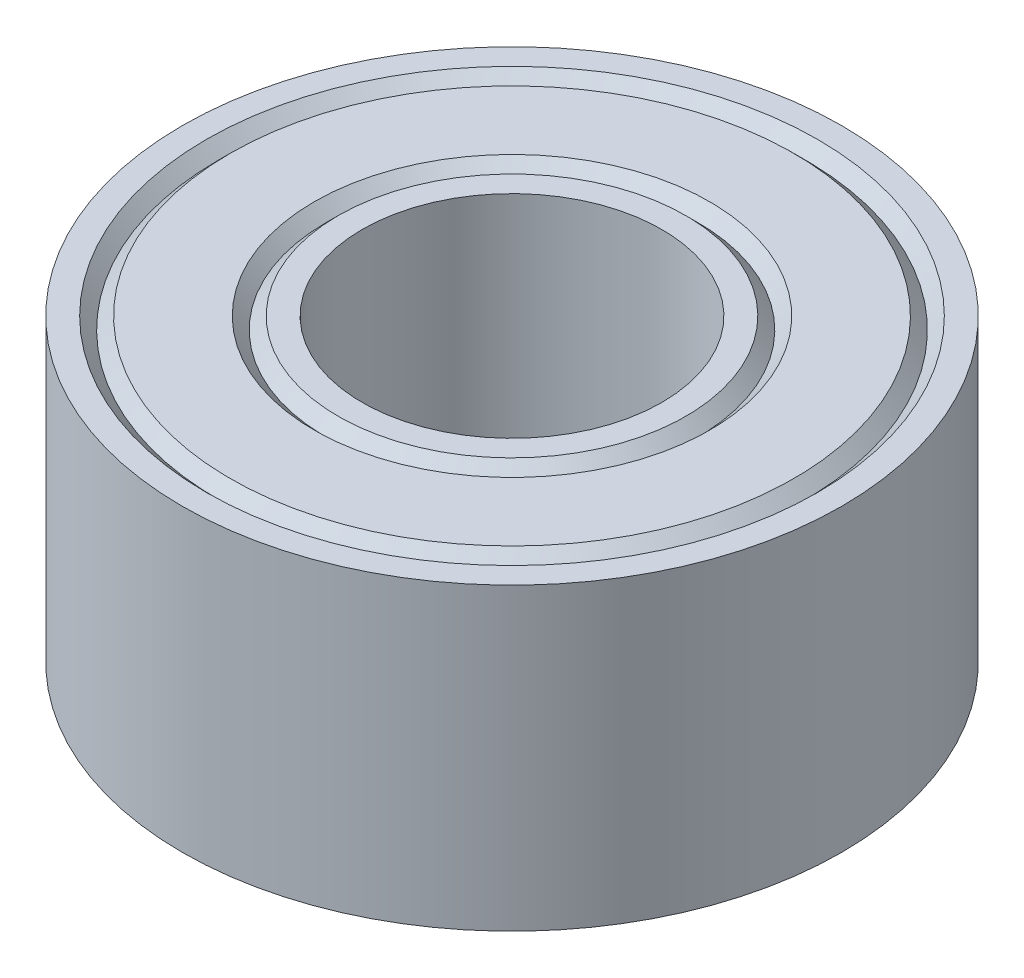
ISO-10303-21;
HEADER;
FILE_DESCRIPTION(('STEP AP214'),'2;1');
FILE_NAME('part.step','',(''),(''),'','','');
FILE_SCHEMA(('AUTOMOTIVE_DESIGN { 1 0 10303 214 1 1 1 1 }'));
ENDSEC;
DATA;
#1=APPLICATION_CONTEXT('core data for automotive mechanical design processes');
#2=APPLICATION_PROTOCOL_DEFINITION('international standard','automotive_design',2000,#1);
#3=PRODUCT_CONTEXT('',#1,'mechanical');
#4=PRODUCT('Part','Part','',(#3));
#5=PRODUCT_RELATED_PRODUCT_CATEGORY('part','',(#4));
#6=PRODUCT_DEFINITION_FORMATION('','',#4);
#7=PRODUCT_DEFINITION_CONTEXT('part definition',#1,'design');
#8=PRODUCT_DEFINITION('design','',#6,#7);
#9=PRODUCT_DEFINITION_SHAPE('','',#8);
#10=(LENGTH_UNIT() NAMED_UNIT(*) SI_UNIT(.MILLI.,.METRE.));
#11=(NAMED_UNIT(*) PLANE_ANGLE_UNIT() SI_UNIT($,.RADIAN.));
#12=(NAMED_UNIT(*) SI_UNIT($,.STERADIAN.) SOLID_ANGLE_UNIT());
#13=UNCERTAINTY_MEASURE_WITH_UNIT(LENGTH_MEASURE(1.E-05),#10,'distance_accuracy_value','');
#14=(GEOMETRIC_REPRESENTATION_CONTEXT(3) GLOBAL_UNCERTAINTY_ASSIGNED_CONTEXT((#13)) GLOBAL_UNIT_ASSIGNED_CONTEXT((#10,
#11,#12)) REPRESENTATION_CONTEXT('',''));
#15=CARTESIAN_POINT('',(0.,0.,0.));
#16=DIRECTION('',(0.,0.,1.));
#17=DIRECTION('',(1.,0.,0.));
#18=AXIS2_PLACEMENT_3D('',#15,#16,#17);
#19=CARTESIAN_POINT('',(0.,2.5,0.));
#20=DIRECTION('',(0.,1.,0.));
#21=DIRECTION('',(-1.,0.,0.));
#22=AXIS2_PLACEMENT_3D('',#19,#20,#21);
#23=CYLINDRICAL_SURFACE('',#22,2.5);
#24=CARTESIAN_POINT('',(0.,2.5,0.));
#25=DIRECTION('',(0.,1.,0.));
#26=DIRECTION('',(-1.,0.,0.));
#27=AXIS2_PLACEMENT_3D('',#24,#25,#26);
#28=CIRCLE('',#27,2.5);
#29=CARTESIAN_POINT('',(-2.5,2.5,0.));
#30=VERTEX_POINT('',#29);
#31=EDGE_CURVE('E83',#30,#30,#28,.T.);
#32=ORIENTED_EDGE('',*,*,#31,.T.);
#33=EDGE_LOOP('',(#32));
#34=FACE_BOUND('',#33,.T.);
#35=CARTESIAN_POINT('',(0.,-2.5,0.));
#36=DIRECTION('',(0.,1.,0.));
#37=DIRECTION('',(-1.,0.,0.));
#38=AXIS2_PLACEMENT_3D('',#35,#36,#37);
#39=CIRCLE('',#38,2.5);
#40=CARTESIAN_POINT('',(-2.5,-2.5,0.));
#41=VERTEX_POINT('',#40);
#42=EDGE_CURVE('E10',#41,#41,#39,.T.);
#43=ORIENTED_EDGE('',*,*,#42,.F.);
#44=EDGE_LOOP('',(#43));
#45=FACE_BOUND('',#44,.T.);
#46=ADVANCED_FACE('F31',(#34,#45),#23,.F.);
#47=CARTESIAN_POINT('',(-2.5,-2.5,0.));
#48=DIRECTION('',(0.,-1.,0.));
#49=DIRECTION('',(1.,0.,0.));
#50=AXIS2_PLACEMENT_3D('',#47,#48,#49);
#51=PLANE('',#50);
#52=ORIENTED_EDGE('',*,*,#42,.T.);
#53=EDGE_LOOP('',(#52));
#54=FACE_BOUND('',#53,.T.);
#55=CARTESIAN_POINT('',(0.,-2.5,0.));
#56=DIRECTION('',(0.,1.,0.));
#57=DIRECTION('',(-1.,0.,0.));
#58=AXIS2_PLACEMENT_3D('',#55,#56,#57);
#59=CIRCLE('',#58,2.9);
#60=CARTESIAN_POINT('',(-2.9,-2.5,0.));
#61=VERTEX_POINT('',#60);
#62=EDGE_CURVE('E37',#61,#61,#59,.T.);
#63=ORIENTED_EDGE('',*,*,#62,.F.);
#64=EDGE_LOOP('',(#63));
#65=FACE_BOUND('',#64,.T.);
#66=ADVANCED_FACE('F101',(#54,#65),#51,.T.);
#67=CARTESIAN_POINT('',(0.,-2.3,0.));
#68=DIRECTION('',(0.,1.,0.));
#69=DIRECTION('',(-1.,0.,0.));
#70=AXIS2_PLACEMENT_3D('',#67,#68,#69);
#71=CONICAL_SURFACE('',#70,3.1,0.785398163397449);
#72=ORIENTED_EDGE('',*,*,#62,.T.);
#73=EDGE_LOOP('',(#72));
#74=FACE_BOUND('',#73,.T.);
#75=CARTESIAN_POINT('',(0.,-2.3,0.));
#76=DIRECTION('',(0.,1.,0.));
#77=DIRECTION('',(-1.,0.,0.));
#78=AXIS2_PLACEMENT_3D('',#75,#76,#77);
#79=CIRCLE('',#78,3.1);
#80=CARTESIAN_POINT('',(-3.1,-2.3,0.));
#81=VERTEX_POINT('',#80);
#82=EDGE_CURVE('E41',#81,#81,#79,.T.);
#83=ORIENTED_EDGE('',*,*,#82,.F.);
#84=EDGE_LOOP('',(#83));
#85=FACE_BOUND('',#84,.T.);
#86=ADVANCED_FACE('F105',(#74,#85),#71,.T.);
#87=CARTESIAN_POINT('',(0.,-2.5,0.));
#88=DIRECTION('',(0.,-1.,0.));
#89=DIRECTION('',(1.,0.,0.));
#90=AXIS2_PLACEMENT_3D('',#87,#88,#89);
#91=CONICAL_SURFACE('',#90,3.3,0.785398163397448);
#92=ORIENTED_EDGE('',*,*,#82,.T.);
#93=EDGE_LOOP('',(#92));
#94=FACE_BOUND('',#93,.T.);
#95=CARTESIAN_POINT('',(0.,-2.5,0.));
#96=DIRECTION('',(0.,1.,0.));
#97=DIRECTION('',(-1.,0.,0.));
#98=AXIS2_PLACEMENT_3D('',#95,#96,#97);
#99=CIRCLE('',#98,3.3);
#100=CARTESIAN_POINT('',(-3.3,-2.5,0.));
#101=VERTEX_POINT('',#100);
#102=EDGE_CURVE('E45',#101,#101,#99,.T.);
#103=ORIENTED_EDGE('',*,*,#102,.F.);
#104=EDGE_LOOP('',(#103));
#105=FACE_BOUND('',#104,.T.);
#106=ADVANCED_FACE('F109',(#94,#105),#91,.F.);
#107=CARTESIAN_POINT('',(-3.3,-2.5,0.));
#108=DIRECTION('',(0.,-1.,0.));
#109=DIRECTION('',(1.,0.,0.));
#110=AXIS2_PLACEMENT_3D('',#107,#108,#109);
#111=PLANE('',#110);
#112=ORIENTED_EDGE('',*,*,#102,.T.);
#113=EDGE_LOOP('',(#112));
#114=FACE_BOUND('',#113,.T.);
#115=CARTESIAN_POINT('',(0.,-2.5,0.));
#116=DIRECTION('',(0.,1.,0.));
#117=DIRECTION('',(-1.,0.,0.));
#118=AXIS2_PLACEMENT_3D('',#115,#116,#117);
#119=CIRCLE('',#118,4.7);
#120=CARTESIAN_POINT('',(-4.7,-2.5,0.));
#121=VERTEX_POINT('',#120);
#122=EDGE_CURVE('E50',#121,#121,#119,.T.);
#123=ORIENTED_EDGE('',*,*,#122,.F.);
#124=EDGE_LOOP('',(#123));
#125=FACE_BOUND('',#124,.T.);
#126=ADVANCED_FACE('F115',(#114,#125),#111,.T.);
#127=CARTESIAN_POINT('',(0.,-2.3,0.));
#128=DIRECTION('',(0.,1.,0.));
#129=DIRECTION('',(-1.,0.,0.));
#130=AXIS2_PLACEMENT_3D('',#127,#128,#129);
#131=CONICAL_SURFACE('',#130,4.9,0.78539816339745);
#132=ORIENTED_EDGE('',*,*,#122,.T.);
#133=EDGE_LOOP('',(#132));
#134=FACE_BOUND('',#133,.T.);
#135=CARTESIAN_POINT('',(0.,-2.3,0.));
#136=DIRECTION('',(0.,1.,0.));
#137=DIRECTION('',(-1.,0.,0.));
#138=AXIS2_PLACEMENT_3D('',#135,#136,#137);
#139=CIRCLE('',#138,4.9);
#140=CARTESIAN_POINT('',(-4.9,-2.3,0.));
#141=VERTEX_POINT('',#140);
#142=EDGE_CURVE('E53',#141,#141,#139,.T.);
#143=ORIENTED_EDGE('',*,*,#142,.F.);
#144=EDGE_LOOP('',(#143));
#145=FACE_BOUND('',#144,.T.);
#146=ADVANCED_FACE('F119',(#134,#145),#131,.T.);
#147=CARTESIAN_POINT('',(0.,-2.5,0.));
#148=DIRECTION('',(0.,-1.,0.));
#149=DIRECTION('',(1.,0.,0.));
#150=AXIS2_PLACEMENT_3D('',#147,#148,#149);
#151=CONICAL_SURFACE('',#150,5.1,0.785398163397448);
#152=ORIENTED_EDGE('',*,*,#142,.T.);
#153=EDGE_LOOP('',(#152));
#154=FACE_BOUND('',#153,.T.);
#155=CARTESIAN_POINT('',(0.,-2.5,0.));
#156=DIRECTION('',(0.,1.,0.));
#157=DIRECTION('',(-1.,0.,0.));
#158=AXIS2_PLACEMENT_3D('',#155,#156,#157);
#159=CIRCLE('',#158,5.1);
#160=CARTESIAN_POINT('',(-5.1,-2.5,0.));
#161=VERTEX_POINT('',#160);
#162=EDGE_CURVE('E56',#161,#161,#159,.T.);
#163=ORIENTED_EDGE('',*,*,#162,.F.);
#164=EDGE_LOOP('',(#163));
#165=FACE_BOUND('',#164,.T.);
#166=ADVANCED_FACE('F123',(#154,#165),#151,.F.);
#167=CARTESIAN_POINT('',(-5.1,-2.5,0.));
#168=DIRECTION('',(0.,-1.,0.));
#169=DIRECTION('',(1.,0.,0.));
#170=AXIS2_PLACEMENT_3D('',#167,#168,#169);
#171=PLANE('',#170);
#172=ORIENTED_EDGE('',*,*,#162,.T.);
#173=EDGE_LOOP('',(#172));
#174=FACE_BOUND('',#173,.T.);
#175=CARTESIAN_POINT('',(0.,-2.5,0.));
#176=DIRECTION('',(0.,1.,0.));
#177=DIRECTION('',(-1.,0.,0.));
#178=AXIS2_PLACEMENT_3D('',#175,#176,#177);
#179=CIRCLE('',#178,5.5);
#180=CARTESIAN_POINT('',(-5.5,-2.5,0.));
#181=VERTEX_POINT('',#180);
#182=EDGE_CURVE('E59',#181,#181,#179,.T.);
#183=ORIENTED_EDGE('',*,*,#182,.F.);
#184=EDGE_LOOP('',(#183));
#185=FACE_BOUND('',#184,.T.);
#186=ADVANCED_FACE('F127',(#174,#185),#171,.T.);
#187=CARTESIAN_POINT('',(0.,2.5,0.));
#188=DIRECTION('',(0.,1.,0.));
#189=DIRECTION('',(-1.,0.,0.));
#190=AXIS2_PLACEMENT_3D('',#187,#188,#189);
#191=CYLINDRICAL_SURFACE('',#190,5.5);
#192=ORIENTED_EDGE('',*,*,#182,.T.);
#193=EDGE_LOOP('',(#192));
#194=FACE_BOUND('',#193,.T.);
#195=CARTESIAN_POINT('',(0.,2.5,0.));
#196=DIRECTION('',(0.,1.,0.));
#197=DIRECTION('',(-1.,0.,0.));
#198=AXIS2_PLACEMENT_3D('',#195,#196,#197);
#199=CIRCLE('',#198,5.5);
#200=CARTESIAN_POINT('',(-5.5,2.5,0.));
#201=VERTEX_POINT('',#200);
#202=EDGE_CURVE('E62',#201,#201,#199,.T.);
#203=ORIENTED_EDGE('',*,*,#202,.F.);
#204=EDGE_LOOP('',(#203));
#205=FACE_BOUND('',#204,.T.);
#206=ADVANCED_FACE('F131',(#194,#205),#191,.T.);
#207=CARTESIAN_POINT('',(-5.1,2.5,0.));
#208=DIRECTION('',(0.,1.,0.));
#209=DIRECTION('',(-1.,0.,0.));
#210=AXIS2_PLACEMENT_3D('',#207,#208,#209);
#211=PLANE('',#210);
#212=ORIENTED_EDGE('',*,*,#202,.T.);
#213=EDGE_LOOP('',(#212));
#214=FACE_BOUND('',#213,.T.);
#215=CARTESIAN_POINT('',(0.,2.5,0.));
#216=DIRECTION('',(0.,1.,0.));
#217=DIRECTION('',(-1.,0.,0.));
#218=AXIS2_PLACEMENT_3D('',#215,#216,#217);
#219=CIRCLE('',#218,5.1);
#220=CARTESIAN_POINT('',(-5.1,2.5,0.));
#221=VERTEX_POINT('',#220);
#222=EDGE_CURVE('E65',#221,#221,#219,.T.);
#223=ORIENTED_EDGE('',*,*,#222,.F.);
#224=EDGE_LOOP('',(#223));
#225=FACE_BOUND('',#224,.T.);
#226=ADVANCED_FACE('F135',(#214,#225),#211,.T.);
#227=CARTESIAN_POINT('',(0.,2.3,0.));
#228=DIRECTION('',(0.,1.,0.));
#229=DIRECTION('',(-1.,0.,0.));
#230=AXIS2_PLACEMENT_3D('',#227,#228,#229);
#231=CONICAL_SURFACE('',#230,4.9,0.785398163397447);
#232=ORIENTED_EDGE('',*,*,#222,.T.);
#233=EDGE_LOOP('',(#232));
#234=FACE_BOUND('',#233,.T.);
#235=CARTESIAN_POINT('',(0.,2.3,0.));
#236=DIRECTION('',(0.,1.,0.));
#237=DIRECTION('',(-1.,0.,0.));
#238=AXIS2_PLACEMENT_3D('',#235,#236,#237);
#239=CIRCLE('',#238,4.9);
#240=CARTESIAN_POINT('',(-4.9,2.3,0.));
#241=VERTEX_POINT('',#240);
#242=EDGE_CURVE('E68',#241,#241,#239,.T.);
#243=ORIENTED_EDGE('',*,*,#242,.F.);
#244=EDGE_LOOP('',(#243));
#245=FACE_BOUND('',#244,.T.);
#246=ADVANCED_FACE('F139',(#234,#245),#231,.F.);
#247=CARTESIAN_POINT('',(0.,2.5,0.));
#248=DIRECTION('',(0.,-1.,0.));
#249=DIRECTION('',(1.,0.,0.));
#250=AXIS2_PLACEMENT_3D('',#247,#248,#249);
#251=CONICAL_SURFACE('',#250,4.7,0.785398163397449);
#252=ORIENTED_EDGE('',*,*,#242,.T.);
#253=EDGE_LOOP('',(#252));
#254=FACE_BOUND('',#253,.T.);
#255=CARTESIAN_POINT('',(0.,2.5,0.));
#256=DIRECTION('',(0.,1.,0.));
#257=DIRECTION('',(-1.,0.,0.));
#258=AXIS2_PLACEMENT_3D('',#255,#256,#257);
#259=CIRCLE('',#258,4.7);
#260=CARTESIAN_POINT('',(-4.7,2.5,0.));
#261=VERTEX_POINT('',#260);
#262=EDGE_CURVE('E71',#261,#261,#259,.T.);
#263=ORIENTED_EDGE('',*,*,#262,.F.);
#264=EDGE_LOOP('',(#263));
#265=FACE_BOUND('',#264,.T.);
#266=ADVANCED_FACE('F143',(#254,#265),#251,.T.);
#267=CARTESIAN_POINT('',(-3.3,2.5,0.));
#268=DIRECTION('',(0.,1.,0.));
#269=DIRECTION('',(-1.,0.,0.));
#270=AXIS2_PLACEMENT_3D('',#267,#268,#269);
#271=PLANE('',#270);
#272=ORIENTED_EDGE('',*,*,#262,.T.);
#273=EDGE_LOOP('',(#272));
#274=FACE_BOUND('',#273,.T.);
#275=CARTESIAN_POINT('',(0.,2.5,0.));
#276=DIRECTION('',(0.,1.,0.));
#277=DIRECTION('',(-1.,0.,0.));
#278=AXIS2_PLACEMENT_3D('',#275,#276,#277);
#279=CIRCLE('',#278,3.3);
#280=CARTESIAN_POINT('',(-3.3,2.5,0.));
#281=VERTEX_POINT('',#280);
#282=EDGE_CURVE('E74',#281,#281,#279,.T.);
#283=ORIENTED_EDGE('',*,*,#282,.F.);
#284=EDGE_LOOP('',(#283));
#285=FACE_BOUND('',#284,.T.);
#286=ADVANCED_FACE('F147',(#274,#285),#271,.T.);
#287=CARTESIAN_POINT('',(0.,2.3,0.));
#288=DIRECTION('',(0.,1.,0.));
#289=DIRECTION('',(-1.,0.,0.));
#290=AXIS2_PLACEMENT_3D('',#287,#288,#289);
#291=CONICAL_SURFACE('',#290,3.1,0.785398163397448);
#292=ORIENTED_EDGE('',*,*,#282,.T.);
#293=EDGE_LOOP('',(#292));
#294=FACE_BOUND('',#293,.T.);
#295=CARTESIAN_POINT('',(0.,2.3,0.));
#296=DIRECTION('',(0.,1.,0.));
#297=DIRECTION('',(-1.,0.,0.));
#298=AXIS2_PLACEMENT_3D('',#295,#296,#297);
#299=CIRCLE('',#298,3.1);
#300=CARTESIAN_POINT('',(-3.1,2.3,0.));
#301=VERTEX_POINT('',#300);
#302=EDGE_CURVE('E77',#301,#301,#299,.T.);
#303=ORIENTED_EDGE('',*,*,#302,.F.);
#304=EDGE_LOOP('',(#303));
#305=FACE_BOUND('',#304,.T.);
#306=ADVANCED_FACE('F97',(#294,#305),#291,.F.);
#307=CARTESIAN_POINT('',(0.,2.5,0.));
#308=DIRECTION('',(0.,-1.,0.));
#309=DIRECTION('',(1.,0.,0.));
#310=AXIS2_PLACEMENT_3D('',#307,#308,#309);
#311=CONICAL_SURFACE('',#310,2.9,0.785398163397446);
#312=ORIENTED_EDGE('',*,*,#302,.T.);
#313=EDGE_LOOP('',(#312));
#314=FACE_BOUND('',#313,.T.);
#315=CARTESIAN_POINT('',(0.,2.5,0.));
#316=DIRECTION('',(0.,1.,0.));
#317=DIRECTION('',(-1.,0.,0.));
#318=AXIS2_PLACEMENT_3D('',#315,#316,#317);
#319=CIRCLE('',#318,2.9);
#320=CARTESIAN_POINT('',(-2.9,2.5,0.));
#321=VERTEX_POINT('',#320);
#322=EDGE_CURVE('E80',#321,#321,#319,.T.);
#323=ORIENTED_EDGE('',*,*,#322,.F.);
#324=EDGE_LOOP('',(#323));
#325=FACE_BOUND('',#324,.T.);
#326=ADVANCED_FACE('F91',(#314,#325),#311,.T.);
#327=CARTESIAN_POINT('',(-2.5,2.5,0.));
#328=DIRECTION('',(0.,1.,0.));
#329=DIRECTION('',(-1.,0.,0.));
#330=AXIS2_PLACEMENT_3D('',#327,#328,#329);
#331=PLANE('',#330);
#332=ORIENTED_EDGE('',*,*,#322,.T.);
#333=EDGE_LOOP('',(#332));
#334=FACE_BOUND('',#333,.T.);
#335=ORIENTED_EDGE('',*,*,#31,.F.);
#336=EDGE_LOOP('',(#335));
#337=FACE_BOUND('',#336,.T.);
#338=ADVANCED_FACE('F89',(#334,#337),#331,.T.);
#339=CLOSED_SHELL('',(#46,#66,#86,#106,#126,#146,#166,#186,#206,#226,#246,#266,#286,#306,#326,#338));
#340=MANIFOLD_SOLID_BREP('B2',#339);
#341=ADVANCED_BREP_SHAPE_REPRESENTATION('',(#18,#340),#14);
#342=SHAPE_DEFINITION_REPRESENTATION(#9,#341);
ENDSEC;
END-ISO-10303-21;
